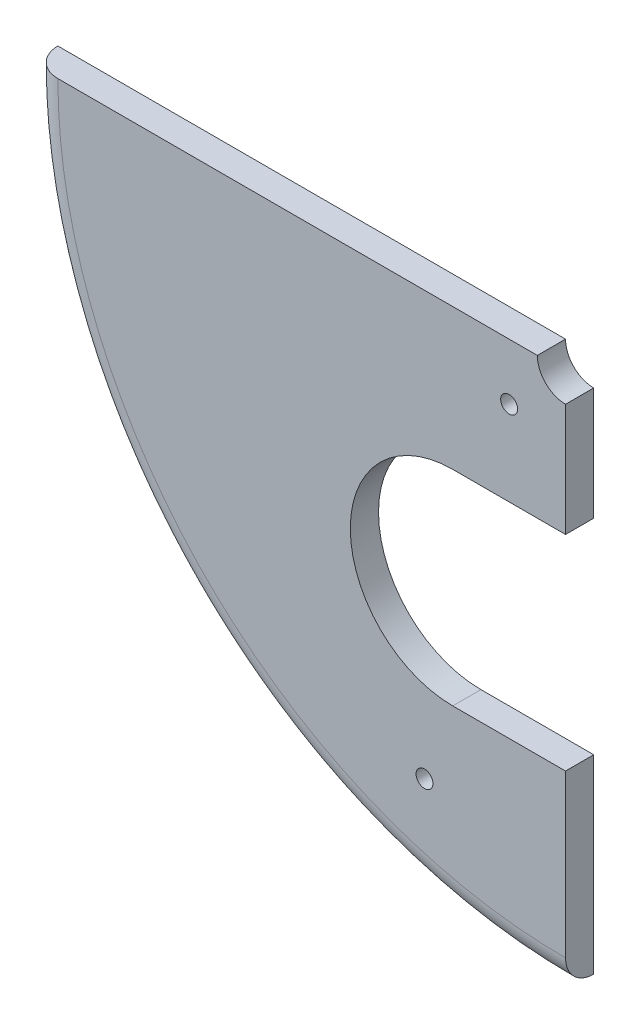
ISO-10303-21;
HEADER;
FILE_DESCRIPTION(('STEP AP214'),'2;1');
FILE_NAME('part.step','',(''),(''),'','','');
FILE_SCHEMA(('AUTOMOTIVE_DESIGN { 1 0 10303 214 1 1 1 1 }'));
ENDSEC;
DATA;
#1=APPLICATION_CONTEXT('core data for automotive mechanical design processes');
#2=APPLICATION_PROTOCOL_DEFINITION('international standard','automotive_design',2000,#1);
#3=PRODUCT_CONTEXT('',#1,'mechanical');
#4=PRODUCT('Part','Part','',(#3));
#5=PRODUCT_RELATED_PRODUCT_CATEGORY('part','',(#4));
#6=PRODUCT_DEFINITION_FORMATION('','',#4);
#7=PRODUCT_DEFINITION_CONTEXT('part definition',#1,'design');
#8=PRODUCT_DEFINITION('design','',#6,#7);
#9=PRODUCT_DEFINITION_SHAPE('','',#8);
#10=(LENGTH_UNIT() NAMED_UNIT(*) SI_UNIT(.MILLI.,.METRE.));
#11=(NAMED_UNIT(*) PLANE_ANGLE_UNIT() SI_UNIT($,.RADIAN.));
#12=(NAMED_UNIT(*) SI_UNIT($,.STERADIAN.) SOLID_ANGLE_UNIT());
#13=UNCERTAINTY_MEASURE_WITH_UNIT(LENGTH_MEASURE(1.E-05),#10,'distance_accuracy_value','');
#14=(GEOMETRIC_REPRESENTATION_CONTEXT(3) GLOBAL_UNCERTAINTY_ASSIGNED_CONTEXT((#13)) GLOBAL_UNIT_ASSIGNED_CONTEXT((#10,
#11,#12)) REPRESENTATION_CONTEXT('',''));
#15=CARTESIAN_POINT('',(0.,0.,0.));
#16=DIRECTION('',(0.,0.,1.));
#17=DIRECTION('',(1.,0.,0.));
#18=AXIS2_PLACEMENT_3D('',#15,#16,#17);
#19=CARTESIAN_POINT('',(0.,-5.,5.));
#20=DIRECTION('',(1.,0.,0.));
#21=DIRECTION('',(0.,1.,0.));
#22=AXIS2_PLACEMENT_3D('',#19,#20,#21);
#23=PLANE('',#22);
#24=DIRECTION('',(0.,0.,-1.));
#25=VECTOR('',#24,1.);
#26=CARTESIAN_POINT('',(6.93889390390723E-13,-25.,5.));
#27=LINE('',#26,#25);
#28=CARTESIAN_POINT('',(6.93889390390723E-13,-25.,5.));
#29=VERTEX_POINT('',#28);
#30=CARTESIAN_POINT('',(6.93889390390723E-13,-25.,0.));
#31=VERTEX_POINT('',#30);
#32=EDGE_CURVE('E128',#29,#31,#27,.T.);
#33=ORIENTED_EDGE('',*,*,#32,.T.);
#34=DIRECTION('',(0.,-1.,0.));
#35=VECTOR('',#34,1.);
#36=CARTESIAN_POINT('',(0.,-5.,0.));
#37=LINE('',#36,#35);
#38=CARTESIAN_POINT('',(0.,-5.,0.));
#39=VERTEX_POINT('',#38);
#40=EDGE_CURVE('E171',#39,#31,#37,.T.);
#41=ORIENTED_EDGE('',*,*,#40,.F.);
#42=DIRECTION('',(0.,0.,-1.));
#43=VECTOR('',#42,1.);
#44=CARTESIAN_POINT('',(0.,-5.,5.));
#45=LINE('',#44,#43);
#46=CARTESIAN_POINT('',(0.,-5.,5.));
#47=VERTEX_POINT('',#46);
#48=EDGE_CURVE('E154',#47,#39,#45,.T.);
#49=ORIENTED_EDGE('',*,*,#48,.F.);
#50=DIRECTION('',(0.,-1.,0.));
#51=VECTOR('',#50,1.);
#52=CARTESIAN_POINT('',(0.,-5.,5.));
#53=LINE('',#52,#51);
#54=EDGE_CURVE('E147',#47,#29,#53,.T.);
#55=ORIENTED_EDGE('',*,*,#54,.T.);
#56=EDGE_LOOP('',(#33,#41,#49,#55));
#57=FACE_BOUND('',#56,.T.);
#58=ADVANCED_FACE('F63',(#57),#23,.T.);
#59=CARTESIAN_POINT('',(0.,0.,5.));
#60=DIRECTION('',(0.,0.,1.));
#61=DIRECTION('',(1.,0.,0.));
#62=AXIS2_PLACEMENT_3D('',#59,#60,#61);
#63=PLANE('',#62);
#64=DIRECTION('',(-1.,0.,0.));
#65=VECTOR('',#64,1.);
#66=CARTESIAN_POINT('',(-5.,0.,5.));
#67=LINE('',#66,#65);
#68=CARTESIAN_POINT('',(-5.,0.,5.));
#69=VERTEX_POINT('',#68);
#70=CARTESIAN_POINT('',(-90.,0.,5.));
#71=VERTEX_POINT('',#70);
#72=EDGE_CURVE('E161',#69,#71,#67,.T.);
#73=ORIENTED_EDGE('',*,*,#72,.T.);
#74=CARTESIAN_POINT('',(0.,0.,5.));
#75=DIRECTION('',(0.,0.,1.));
#76=DIRECTION('',(1.,0.,0.));
#77=AXIS2_PLACEMENT_3D('',#74,#75,#76);
#78=CIRCLE('',#77,90.);
#79=CARTESIAN_POINT('',(0.,-90.,5.));
#80=VERTEX_POINT('',#79);
#81=EDGE_CURVE('E178',#71,#80,#78,.T.);
#82=ORIENTED_EDGE('',*,*,#81,.T.);
#83=CARTESIAN_POINT('',(0.,-61.3120715109094,5.));
#84=VERTEX_POINT('',#83);
#85=EDGE_CURVE('E156',#84,#80,#53,.T.);
#86=ORIENTED_EDGE('',*,*,#85,.F.);
#87=DIRECTION('',(-1.,0.,0.));
#88=VECTOR('',#87,1.);
#89=CARTESIAN_POINT('',(-19.9999999999989,-61.3120715109094,5.));
#90=LINE('',#89,#88);
#91=CARTESIAN_POINT('',(-19.9999999999989,-61.3120715109094,5.));
#92=VERTEX_POINT('',#91);
#93=EDGE_CURVE('E151',#84,#92,#90,.T.);
#94=ORIENTED_EDGE('',*,*,#93,.T.);
#95=CARTESIAN_POINT('',(-19.9999999999989,-43.1560357554547,5.));
#96=DIRECTION('',(0.,0.,-1.));
#97=DIRECTION('',(-1.,0.,0.));
#98=AXIS2_PLACEMENT_3D('',#95,#96,#97);
#99=CIRCLE('',#98,18.1560357554547);
#100=CARTESIAN_POINT('',(-19.9999999999989,-25.,5.));
#101=VERTEX_POINT('',#100);
#102=EDGE_CURVE('E140',#92,#101,#99,.T.);
#103=ORIENTED_EDGE('',*,*,#102,.T.);
#104=DIRECTION('',(1.,0.,0.));
#105=VECTOR('',#104,1.);
#106=CARTESIAN_POINT('',(-19.9999999999988,-25.,5.));
#107=LINE('',#106,#105);
#108=EDGE_CURVE('E131',#101,#29,#107,.T.);
#109=ORIENTED_EDGE('',*,*,#108,.T.);
#110=ORIENTED_EDGE('',*,*,#54,.F.);
#111=CARTESIAN_POINT('',(0.,0.,5.));
#112=DIRECTION('',(0.,0.,1.));
#113=DIRECTION('',(1.,0.,0.));
#114=AXIS2_PLACEMENT_3D('',#111,#112,#113);
#115=CIRCLE('',#114,5.);
#116=EDGE_CURVE('E155',#69,#47,#115,.T.);
#117=ORIENTED_EDGE('',*,*,#116,.F.);
#118=EDGE_LOOP('',(#73,#82,#86,#94,#103,#109,#110,#117));
#119=FACE_BOUND('',#118,.T.);
#120=CARTESIAN_POINT('',(-10.,-10.,5.));
#121=DIRECTION('',(0.,0.,1.));
#122=DIRECTION('',(1.,0.,0.));
#123=AXIS2_PLACEMENT_3D('',#120,#121,#122);
#124=CIRCLE('',#123,1.5);
#125=CARTESIAN_POINT('',(-8.49999999999999,-10.,5.));
#126=VERTEX_POINT('',#125);
#127=EDGE_CURVE('E168',#126,#126,#124,.T.);
#128=ORIENTED_EDGE('',*,*,#127,.F.);
#129=EDGE_LOOP('',(#128));
#130=FACE_BOUND('',#129,.T.);
#131=CARTESIAN_POINT('',(-24.9999999999988,-74.9999999999948,5.));
#132=DIRECTION('',(0.,0.,1.));
#133=DIRECTION('',(1.,0.,0.));
#134=AXIS2_PLACEMENT_3D('',#131,#132,#133);
#135=CIRCLE('',#134,1.50000000000307);
#136=CARTESIAN_POINT('',(-23.4999999999958,-74.9999999999948,5.));
#137=VERTEX_POINT('',#136);
#138=EDGE_CURVE('E210',#137,#137,#135,.T.);
#139=ORIENTED_EDGE('',*,*,#138,.F.);
#140=EDGE_LOOP('',(#139));
#141=FACE_BOUND('',#140,.T.);
#142=ADVANCED_FACE('F144',(#119,#130,#141),#63,.T.);
#143=CARTESIAN_POINT('',(0.,0.,0.));
#144=DIRECTION('',(0.,0.,1.));
#145=DIRECTION('',(1.,0.,0.));
#146=AXIS2_PLACEMENT_3D('',#143,#144,#145);
#147=PLANE('',#146);
#148=CARTESIAN_POINT('',(-10.,-10.,0.));
#149=DIRECTION('',(0.,0.,1.));
#150=DIRECTION('',(1.,0.,0.));
#151=AXIS2_PLACEMENT_3D('',#148,#149,#150);
#152=CIRCLE('',#151,1.5);
#153=CARTESIAN_POINT('',(-8.49999999999999,-10.,0.));
#154=VERTEX_POINT('',#153);
#155=EDGE_CURVE('E213',#154,#154,#152,.T.);
#156=ORIENTED_EDGE('',*,*,#155,.T.);
#157=EDGE_LOOP('',(#156));
#158=FACE_BOUND('',#157,.T.);
#159=ORIENTED_EDGE('',*,*,#40,.T.);
#160=DIRECTION('',(1.,0.,0.));
#161=VECTOR('',#160,1.);
#162=CARTESIAN_POINT('',(-19.9999999999988,-25.,0.));
#163=LINE('',#162,#161);
#164=CARTESIAN_POINT('',(-19.9999999999989,-25.,0.));
#165=VERTEX_POINT('',#164);
#166=EDGE_CURVE('E134',#165,#31,#163,.T.);
#167=ORIENTED_EDGE('',*,*,#166,.F.);
#168=CARTESIAN_POINT('',(-19.9999999999989,-43.1560357554547,0.));
#169=DIRECTION('',(0.,0.,-1.));
#170=DIRECTION('',(-1.,0.,0.));
#171=AXIS2_PLACEMENT_3D('',#168,#169,#170);
#172=CIRCLE('',#171,18.1560357554547);
#173=CARTESIAN_POINT('',(-19.9999999999989,-61.3120715109094,0.));
#174=VERTEX_POINT('',#173);
#175=EDGE_CURVE('E152',#174,#165,#172,.T.);
#176=ORIENTED_EDGE('',*,*,#175,.F.);
#177=DIRECTION('',(-1.,0.,0.));
#178=VECTOR('',#177,1.);
#179=CARTESIAN_POINT('',(-19.9999999999989,-61.3120715109094,0.));
#180=LINE('',#179,#178);
#181=CARTESIAN_POINT('',(6.88464944913428E-13,-61.3120715109094,0.));
#182=VERTEX_POINT('',#181);
#183=EDGE_CURVE('E192',#182,#174,#180,.T.);
#184=ORIENTED_EDGE('',*,*,#183,.F.);
#185=CARTESIAN_POINT('',(0.,-95.,0.));
#186=VERTEX_POINT('',#185);
#187=EDGE_CURVE('E170',#182,#186,#37,.T.);
#188=ORIENTED_EDGE('',*,*,#187,.T.);
#189=CARTESIAN_POINT('',(0.,0.,0.));
#190=DIRECTION('',(0.,0.,1.));
#191=DIRECTION('',(1.,0.,0.));
#192=AXIS2_PLACEMENT_3D('',#189,#190,#191);
#193=CIRCLE('',#192,95.);
#194=CARTESIAN_POINT('',(-95.,0.,0.));
#195=VERTEX_POINT('',#194);
#196=EDGE_CURVE('E167',#195,#186,#193,.T.);
#197=ORIENTED_EDGE('',*,*,#196,.F.);
#198=DIRECTION('',(-1.,0.,0.));
#199=VECTOR('',#198,1.);
#200=CARTESIAN_POINT('',(-5.,0.,0.));
#201=LINE('',#200,#199);
#202=CARTESIAN_POINT('',(-5.,0.,0.));
#203=VERTEX_POINT('',#202);
#204=EDGE_CURVE('E165',#203,#195,#201,.T.);
#205=ORIENTED_EDGE('',*,*,#204,.F.);
#206=CARTESIAN_POINT('',(0.,0.,0.));
#207=DIRECTION('',(0.,0.,1.));
#208=DIRECTION('',(1.,0.,0.));
#209=AXIS2_PLACEMENT_3D('',#206,#207,#208);
#210=CIRCLE('',#209,5.);
#211=EDGE_CURVE('E173',#203,#39,#210,.T.);
#212=ORIENTED_EDGE('',*,*,#211,.T.);
#213=EDGE_LOOP('',(#159,#167,#176,#184,#188,#197,#205,#212));
#214=FACE_BOUND('',#213,.T.);
#215=CARTESIAN_POINT('',(-24.9999999999988,-74.9999999999948,0.));
#216=DIRECTION('',(0.,0.,1.));
#217=DIRECTION('',(1.,0.,0.));
#218=AXIS2_PLACEMENT_3D('',#215,#216,#217);
#219=CIRCLE('',#218,1.50000000000307);
#220=CARTESIAN_POINT('',(-23.4999999999958,-74.9999999999948,0.));
#221=VERTEX_POINT('',#220);
#222=EDGE_CURVE('E206',#221,#221,#219,.T.);
#223=ORIENTED_EDGE('',*,*,#222,.T.);
#224=EDGE_LOOP('',(#223));
#225=FACE_BOUND('',#224,.T.);
#226=ADVANCED_FACE('F187',(#158,#214,#225),#147,.F.);
#227=CARTESIAN_POINT('',(-5.,0.,5.));
#228=DIRECTION('',(0.,-1.,0.));
#229=DIRECTION('',(1.,0.,0.));
#230=AXIS2_PLACEMENT_3D('',#227,#228,#229);
#231=PLANE('',#230);
#232=ORIENTED_EDGE('',*,*,#204,.T.);
#233=CARTESIAN_POINT('',(-90.,0.,0.));
#234=DIRECTION('',(0.,-1.,0.));
#235=DIRECTION('',(1.,0.,0.));
#236=AXIS2_PLACEMENT_3D('',#233,#234,#235);
#237=CIRCLE('',#236,5.);
#238=EDGE_CURVE('E12',#195,#71,#237,.F.);
#239=ORIENTED_EDGE('',*,*,#238,.T.);
#240=ORIENTED_EDGE('',*,*,#72,.F.);
#241=DIRECTION('',(0.,0.,-1.));
#242=VECTOR('',#241,1.);
#243=CARTESIAN_POINT('',(-5.,0.,5.));
#244=LINE('',#243,#242);
#245=EDGE_CURVE('E158',#69,#203,#244,.T.);
#246=ORIENTED_EDGE('',*,*,#245,.T.);
#247=EDGE_LOOP('',(#232,#239,#240,#246));
#248=FACE_BOUND('',#247,.T.);
#249=ADVANCED_FACE('F193',(#248),#231,.F.);
#250=ORIENTED_EDGE('',*,*,#85,.T.);
#251=CARTESIAN_POINT('',(0.,-90.,0.));
#252=DIRECTION('',(1.,0.,0.));
#253=DIRECTION('',(0.,1.,0.));
#254=AXIS2_PLACEMENT_3D('',#251,#252,#253);
#255=CIRCLE('',#254,5.);
#256=EDGE_CURVE('E71',#80,#186,#255,.T.);
#257=ORIENTED_EDGE('',*,*,#256,.T.);
#258=ORIENTED_EDGE('',*,*,#187,.F.);
#259=DIRECTION('',(0.,0.,-1.));
#260=VECTOR('',#259,1.);
#261=CARTESIAN_POINT('',(6.88464944913428E-13,-61.3120715109094,5.));
#262=LINE('',#261,#260);
#263=EDGE_CURVE('E139',#84,#182,#262,.T.);
#264=ORIENTED_EDGE('',*,*,#263,.F.);
#265=EDGE_LOOP('',(#250,#257,#258,#264));
#266=FACE_BOUND('',#265,.T.);
#267=ADVANCED_FACE('F182',(#266),#23,.T.);
#268=CARTESIAN_POINT('',(0.,0.,5.));
#269=DIRECTION('',(0.,0.,-1.));
#270=DIRECTION('',(-1.,0.,0.));
#271=AXIS2_PLACEMENT_3D('',#268,#269,#270);
#272=CYLINDRICAL_SURFACE('',#271,5.);
#273=ORIENTED_EDGE('',*,*,#211,.F.);
#274=ORIENTED_EDGE('',*,*,#245,.F.);
#275=ORIENTED_EDGE('',*,*,#116,.T.);
#276=ORIENTED_EDGE('',*,*,#48,.T.);
#277=EDGE_LOOP('',(#273,#274,#275,#276));
#278=FACE_BOUND('',#277,.T.);
#279=ADVANCED_FACE('F196',(#278),#272,.F.);
#280=CARTESIAN_POINT('',(-10.,-10.,5.));
#281=DIRECTION('',(0.,0.,-1.));
#282=DIRECTION('',(-1.,0.,0.));
#283=AXIS2_PLACEMENT_3D('',#280,#281,#282);
#284=CYLINDRICAL_SURFACE('',#283,1.5);
#285=ORIENTED_EDGE('',*,*,#127,.T.);
#286=EDGE_LOOP('',(#285));
#287=FACE_BOUND('',#286,.T.);
#288=ORIENTED_EDGE('',*,*,#155,.F.);
#289=EDGE_LOOP('',(#288));
#290=FACE_BOUND('',#289,.T.);
#291=ADVANCED_FACE('F221',(#287,#290),#284,.F.);
#292=CARTESIAN_POINT('',(-24.9999999999988,-74.9999999999948,5.));
#293=DIRECTION('',(0.,0.,-1.));
#294=DIRECTION('',(-1.,0.,0.));
#295=AXIS2_PLACEMENT_3D('',#292,#293,#294);
#296=CYLINDRICAL_SURFACE('',#295,1.50000000000307);
#297=ORIENTED_EDGE('',*,*,#138,.T.);
#298=EDGE_LOOP('',(#297));
#299=FACE_BOUND('',#298,.T.);
#300=ORIENTED_EDGE('',*,*,#222,.F.);
#301=EDGE_LOOP('',(#300));
#302=FACE_BOUND('',#301,.T.);
#303=ADVANCED_FACE('F223',(#299,#302),#296,.F.);
#304=CARTESIAN_POINT('',(-19.9999999999988,-25.,5.));
#305=DIRECTION('',(0.,1.,0.));
#306=DIRECTION('',(-1.,0.,0.));
#307=AXIS2_PLACEMENT_3D('',#304,#305,#306);
#308=PLANE('',#307);
#309=ORIENTED_EDGE('',*,*,#166,.T.);
#310=ORIENTED_EDGE('',*,*,#32,.F.);
#311=ORIENTED_EDGE('',*,*,#108,.F.);
#312=DIRECTION('',(0.,0.,-1.));
#313=VECTOR('',#312,1.);
#314=CARTESIAN_POINT('',(-19.9999999999989,-25.,5.));
#315=LINE('',#314,#313);
#316=EDGE_CURVE('E204',#101,#165,#315,.T.);
#317=ORIENTED_EDGE('',*,*,#316,.T.);
#318=EDGE_LOOP('',(#309,#310,#311,#317));
#319=FACE_BOUND('',#318,.T.);
#320=ADVANCED_FACE('F130',(#319),#308,.F.);
#321=CARTESIAN_POINT('',(-19.9999999999989,-43.1560357554547,5.));
#322=DIRECTION('',(0.,0.,-1.));
#323=DIRECTION('',(-1.,0.,0.));
#324=AXIS2_PLACEMENT_3D('',#321,#322,#323);
#325=CYLINDRICAL_SURFACE('',#324,18.1560357554547);
#326=ORIENTED_EDGE('',*,*,#175,.T.);
#327=ORIENTED_EDGE('',*,*,#316,.F.);
#328=ORIENTED_EDGE('',*,*,#102,.F.);
#329=DIRECTION('',(0.,0.,-1.));
#330=VECTOR('',#329,1.);
#331=CARTESIAN_POINT('',(-19.9999999999989,-61.3120715109094,5.));
#332=LINE('',#331,#330);
#333=EDGE_CURVE('E207',#92,#174,#332,.T.);
#334=ORIENTED_EDGE('',*,*,#333,.T.);
#335=EDGE_LOOP('',(#326,#327,#328,#334));
#336=FACE_BOUND('',#335,.T.);
#337=ADVANCED_FACE('F262',(#336),#325,.F.);
#338=CARTESIAN_POINT('',(-19.9999999999989,-61.3120715109094,5.));
#339=DIRECTION('',(0.,-1.,0.));
#340=DIRECTION('',(1.,0.,0.));
#341=AXIS2_PLACEMENT_3D('',#338,#339,#340);
#342=PLANE('',#341);
#343=ORIENTED_EDGE('',*,*,#183,.T.);
#344=ORIENTED_EDGE('',*,*,#333,.F.);
#345=ORIENTED_EDGE('',*,*,#93,.F.);
#346=ORIENTED_EDGE('',*,*,#263,.T.);
#347=EDGE_LOOP('',(#343,#344,#345,#346));
#348=FACE_BOUND('',#347,.T.);
#349=ADVANCED_FACE('F257',(#348),#342,.F.);
#350=CARTESIAN_POINT('',(0.,0.,0.));
#351=DIRECTION('',(0.,0.,1.));
#352=DIRECTION('',(1.,0.,0.));
#353=AXIS2_PLACEMENT_3D('',#350,#351,#352);
#354=TOROIDAL_SURFACE('',#353,90.,5.);
#355=ORIENTED_EDGE('',*,*,#238,.F.);
#356=ORIENTED_EDGE('',*,*,#196,.T.);
#357=ORIENTED_EDGE('',*,*,#256,.F.);
#358=ORIENTED_EDGE('',*,*,#81,.F.);
#359=EDGE_LOOP('',(#355,#356,#357,#358));
#360=FACE_BOUND('',#359,.T.);
#361=ADVANCED_FACE('F65',(#360),#354,.T.);
#362=CLOSED_SHELL('',(#58,#142,#226,#249,#267,#279,#291,#303,#320,#337,#349,#361));
#363=MANIFOLD_SOLID_BREP('B2',#362);
#364=ADVANCED_BREP_SHAPE_REPRESENTATION('',(#18,#363),#14);
#365=SHAPE_DEFINITION_REPRESENTATION(#9,#364);
ENDSEC;
END-ISO-10303-21;
